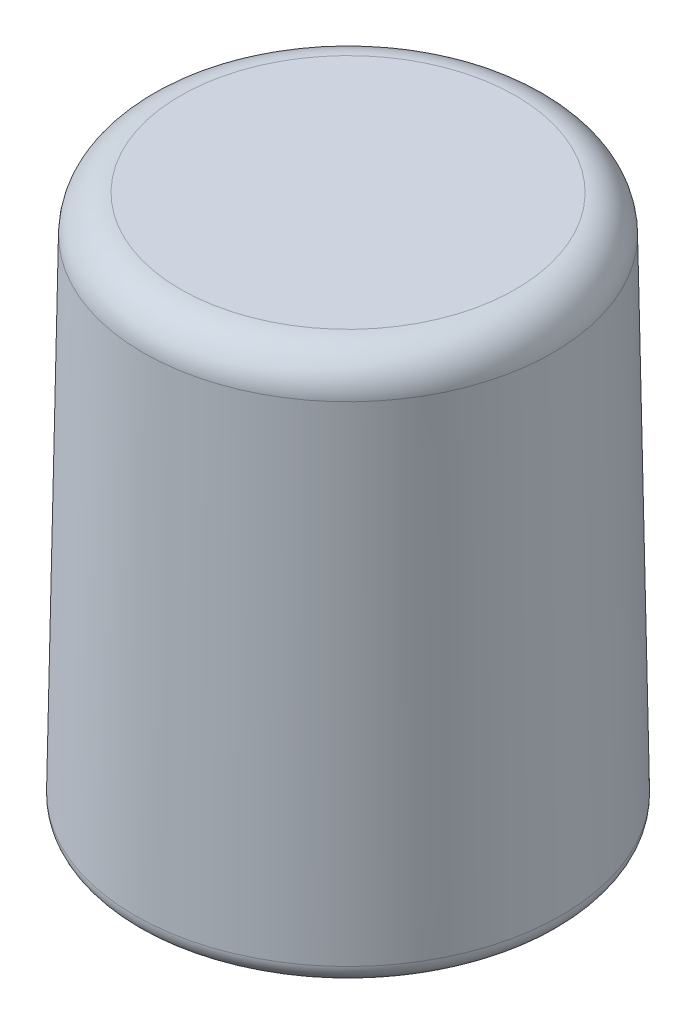
ISO-10303-21;
HEADER;
FILE_DESCRIPTION(('STEP AP214'),'2;1');
FILE_NAME('part.step','',(''),(''),'','','');
FILE_SCHEMA(('AUTOMOTIVE_DESIGN { 1 0 10303 214 1 1 1 1 }'));
ENDSEC;
DATA;
#1=APPLICATION_CONTEXT('core data for automotive mechanical design processes');
#2=APPLICATION_PROTOCOL_DEFINITION('international standard','automotive_design',2000,#1);
#3=PRODUCT_CONTEXT('',#1,'mechanical');
#4=PRODUCT('Part','Part','',(#3));
#5=PRODUCT_RELATED_PRODUCT_CATEGORY('part','',(#4));
#6=PRODUCT_DEFINITION_FORMATION('','',#4);
#7=PRODUCT_DEFINITION_CONTEXT('part definition',#1,'design');
#8=PRODUCT_DEFINITION('design','',#6,#7);
#9=PRODUCT_DEFINITION_SHAPE('','',#8);
#10=(LENGTH_UNIT() NAMED_UNIT(*) SI_UNIT(.MILLI.,.METRE.));
#11=(NAMED_UNIT(*) PLANE_ANGLE_UNIT() SI_UNIT($,.RADIAN.));
#12=(NAMED_UNIT(*) SI_UNIT($,.STERADIAN.) SOLID_ANGLE_UNIT());
#13=UNCERTAINTY_MEASURE_WITH_UNIT(LENGTH_MEASURE(1.E-05),#10,'distance_accuracy_value','');
#14=(GEOMETRIC_REPRESENTATION_CONTEXT(3) GLOBAL_UNCERTAINTY_ASSIGNED_CONTEXT((#13)) GLOBAL_UNIT_ASSIGNED_CONTEXT((#10,
#11,#12)) REPRESENTATION_CONTEXT('',''));
#15=CARTESIAN_POINT('',(0.,0.,0.));
#16=DIRECTION('',(0.,0.,1.));
#17=DIRECTION('',(1.,0.,0.));
#18=AXIS2_PLACEMENT_3D('',#15,#16,#17);
#19=CARTESIAN_POINT('',(0.,0.,0.));
#20=DIRECTION('',(0.,-1.,0.));
#21=DIRECTION('',(0.,0.,1.));
#22=AXIS2_PLACEMENT_3D('',#19,#20,#21);
#23=CONICAL_SURFACE('',#22,5.75,0.0174532925199433);
#24=CARTESIAN_POINT('',(0.,0.508726203218623,0.));
#25=DIRECTION('',(0.,1.,0.));
#26=DIRECTION('',(0.,0.,1.));
#27=AXIS2_PLACEMENT_3D('',#24,#25,#26);
#28=CIRCLE('',#27,5.74112015109213);
#29=CARTESIAN_POINT('',(0.,0.508726203218623,5.74112015109213));
#30=VERTEX_POINT('',#29);
#31=EDGE_CURVE('E47',#30,#30,#28,.T.);
#32=ORIENTED_EDGE('',*,*,#31,.T.);
#33=EDGE_LOOP('',(#32));
#34=FACE_BOUND('',#33,.T.);
#35=CARTESIAN_POINT('',(0.,13.5174524064373,0.));
#36=DIRECTION('',(0.,-1.,0.));
#37=DIRECTION('',(0.,0.,-1.));
#38=AXIS2_PLACEMENT_3D('',#35,#36,#37);
#39=CIRCLE('',#38,5.51405199058154);
#40=CARTESIAN_POINT('',(0.,13.5174524064373,-5.51405199058154));
#41=VERTEX_POINT('',#40);
#42=EDGE_CURVE('E88',#41,#41,#39,.T.);
#43=ORIENTED_EDGE('',*,*,#42,.T.);
#44=EDGE_LOOP('',(#43));
#45=FACE_BOUND('',#44,.T.);
#46=ADVANCED_FACE('F39',(#34,#45),#23,.T.);
#47=CARTESIAN_POINT('',(0.,14.5,0.));
#48=DIRECTION('',(0.,1.,0.));
#49=DIRECTION('',(0.,0.,1.));
#50=AXIS2_PLACEMENT_3D('',#47,#48,#49);
#51=PLANE('',#50);
#52=CARTESIAN_POINT('',(0.,14.5,0.));
#53=DIRECTION('',(0.,1.,0.));
#54=DIRECTION('',(0.,0.,1.));
#55=AXIS2_PLACEMENT_3D('',#52,#53,#54);
#56=CIRCLE('',#55,4.51420429542515);
#57=CARTESIAN_POINT('',(0.,14.5,4.51420429542515));
#58=VERTEX_POINT('',#57);
#59=EDGE_CURVE('E70',#58,#58,#56,.T.);
#60=ORIENTED_EDGE('',*,*,#59,.T.);
#61=EDGE_LOOP('',(#60));
#62=FACE_BOUND('',#61,.T.);
#63=ADVANCED_FACE('F107',(#62),#51,.T.);
#64=CARTESIAN_POINT('',(0.,0.,0.));
#65=DIRECTION('',(0.,1.,0.));
#66=DIRECTION('',(0.,0.,1.));
#67=AXIS2_PLACEMENT_3D('',#64,#65,#66);
#68=PLANE('',#67);
#69=DIRECTION('',(1.,0.,0.));
#70=VECTOR('',#69,1.);
#71=CARTESIAN_POINT('',(2.59807621135332,0.,-1.5));
#72=LINE('',#71,#70);
#73=CARTESIAN_POINT('',(-2.59807621135332,0.,-1.5));
#74=VERTEX_POINT('',#73);
#75=CARTESIAN_POINT('',(2.59807621135332,0.,-1.5));
#76=VERTEX_POINT('',#75);
#77=EDGE_CURVE('E74',#74,#76,#72,.T.);
#78=ORIENTED_EDGE('',*,*,#77,.F.);
#79=CARTESIAN_POINT('',(0.,0.,0.));
#80=DIRECTION('',(0.,-1.,0.));
#81=DIRECTION('',(0.,0.,-1.));
#82=AXIS2_PLACEMENT_3D('',#79,#80,#81);
#83=CIRCLE('',#82,3.);
#84=EDGE_CURVE('E54',#76,#74,#83,.T.);
#85=ORIENTED_EDGE('',*,*,#84,.F.);
#86=EDGE_LOOP('',(#78,#85));
#87=FACE_BOUND('',#86,.T.);
#88=CARTESIAN_POINT('',(0.,0.,0.));
#89=DIRECTION('',(0.,1.,0.));
#90=DIRECTION('',(0.,0.,1.));
#91=AXIS2_PLACEMENT_3D('',#88,#89,#90);
#92=CIRCLE('',#91,5.24119630351394);
#93=CARTESIAN_POINT('',(0.,0.,5.24119630351394));
#94=VERTEX_POINT('',#93);
#95=EDGE_CURVE('E11',#94,#94,#92,.F.);
#96=ORIENTED_EDGE('',*,*,#95,.T.);
#97=EDGE_LOOP('',(#96));
#98=FACE_BOUND('',#97,.T.);
#99=ADVANCED_FACE('F78',(#87,#98),#68,.F.);
#100=CARTESIAN_POINT('',(0.,13.5,0.));
#101=DIRECTION('',(0.,1.,0.));
#102=DIRECTION('',(0.,0.,1.));
#103=AXIS2_PLACEMENT_3D('',#100,#101,#102);
#104=TOROIDAL_SURFACE('',#103,4.51420429542515,1.);
#105=ORIENTED_EDGE('',*,*,#42,.F.);
#106=EDGE_LOOP('',(#105));
#107=FACE_BOUND('',#106,.T.);
#108=ORIENTED_EDGE('',*,*,#59,.F.);
#109=EDGE_LOOP('',(#108));
#110=FACE_BOUND('',#109,.T.);
#111=ADVANCED_FACE('F96',(#107,#110),#104,.T.);
#112=CARTESIAN_POINT('',(0.,0.5,0.));
#113=DIRECTION('',(0.,1.,0.));
#114=DIRECTION('',(0.,0.,1.));
#115=AXIS2_PLACEMENT_3D('',#112,#113,#114);
#116=TOROIDAL_SURFACE('',#115,5.24119630351394,0.5);
#117=ORIENTED_EDGE('',*,*,#95,.F.);
#118=EDGE_LOOP('',(#117));
#119=FACE_BOUND('',#118,.T.);
#120=ORIENTED_EDGE('',*,*,#31,.F.);
#121=EDGE_LOOP('',(#120));
#122=FACE_BOUND('',#121,.T.);
#123=ADVANCED_FACE('F41',(#119,#122),#116,.T.);
#124=CARTESIAN_POINT('',(0.,7.,0.));
#125=DIRECTION('',(0.,-1.,0.));
#126=DIRECTION('',(0.,0.,-1.));
#127=AXIS2_PLACEMENT_3D('',#124,#125,#126);
#128=CYLINDRICAL_SURFACE('',#127,3.);
#129=ORIENTED_EDGE('',*,*,#84,.T.);
#130=DIRECTION('',(0.,-1.,0.));
#131=VECTOR('',#130,1.);
#132=CARTESIAN_POINT('',(-2.59807621135332,7.,-1.5));
#133=LINE('',#132,#131);
#134=CARTESIAN_POINT('',(-2.59807621135332,7.,-1.5));
#135=VERTEX_POINT('',#134);
#136=EDGE_CURVE('E71',#135,#74,#133,.T.);
#137=ORIENTED_EDGE('',*,*,#136,.F.);
#138=CARTESIAN_POINT('',(0.,7.,0.));
#139=DIRECTION('',(0.,-1.,0.));
#140=DIRECTION('',(0.,0.,-1.));
#141=AXIS2_PLACEMENT_3D('',#138,#139,#140);
#142=CIRCLE('',#141,3.);
#143=CARTESIAN_POINT('',(2.59807621135332,7.,-1.5));
#144=VERTEX_POINT('',#143);
#145=EDGE_CURVE('E68',#144,#135,#142,.T.);
#146=ORIENTED_EDGE('',*,*,#145,.F.);
#147=DIRECTION('',(0.,-1.,0.));
#148=VECTOR('',#147,1.);
#149=CARTESIAN_POINT('',(2.59807621135332,7.,-1.5));
#150=LINE('',#149,#148);
#151=EDGE_CURVE('E62',#144,#76,#150,.T.);
#152=ORIENTED_EDGE('',*,*,#151,.T.);
#153=EDGE_LOOP('',(#129,#137,#146,#152));
#154=FACE_BOUND('',#153,.T.);
#155=ADVANCED_FACE('F66',(#154),#128,.F.);
#156=CARTESIAN_POINT('',(2.59807621135332,7.,-1.5));
#157=DIRECTION('',(0.,0.,-1.));
#158=DIRECTION('',(-1.,0.,0.));
#159=AXIS2_PLACEMENT_3D('',#156,#157,#158);
#160=PLANE('',#159);
#161=ORIENTED_EDGE('',*,*,#77,.T.);
#162=ORIENTED_EDGE('',*,*,#151,.F.);
#163=DIRECTION('',(1.,0.,0.));
#164=VECTOR('',#163,1.);
#165=CARTESIAN_POINT('',(2.59807621135332,7.,-1.5));
#166=LINE('',#165,#164);
#167=EDGE_CURVE('E82',#135,#144,#166,.T.);
#168=ORIENTED_EDGE('',*,*,#167,.F.);
#169=ORIENTED_EDGE('',*,*,#136,.T.);
#170=EDGE_LOOP('',(#161,#162,#168,#169));
#171=FACE_BOUND('',#170,.T.);
#172=ADVANCED_FACE('F75',(#171),#160,.F.);
#173=CARTESIAN_POINT('',(0.,7.,0.));
#174=DIRECTION('',(0.,-1.,0.));
#175=DIRECTION('',(0.,0.,-1.));
#176=AXIS2_PLACEMENT_3D('',#173,#174,#175);
#177=PLANE('',#176);
#178=ORIENTED_EDGE('',*,*,#145,.T.);
#179=ORIENTED_EDGE('',*,*,#167,.T.);
#180=EDGE_LOOP('',(#178,#179));
#181=FACE_BOUND('',#180,.T.);
#182=ADVANCED_FACE('F118',(#181),#177,.T.);
#183=CLOSED_SHELL('',(#46,#63,#99,#111,#123,#155,#172,#182));
#184=MANIFOLD_SOLID_BREP('B2',#183);
#185=ADVANCED_BREP_SHAPE_REPRESENTATION('',(#18,#184),#14);
#186=SHAPE_DEFINITION_REPRESENTATION(#9,#185);
ENDSEC;
END-ISO-10303-21;
